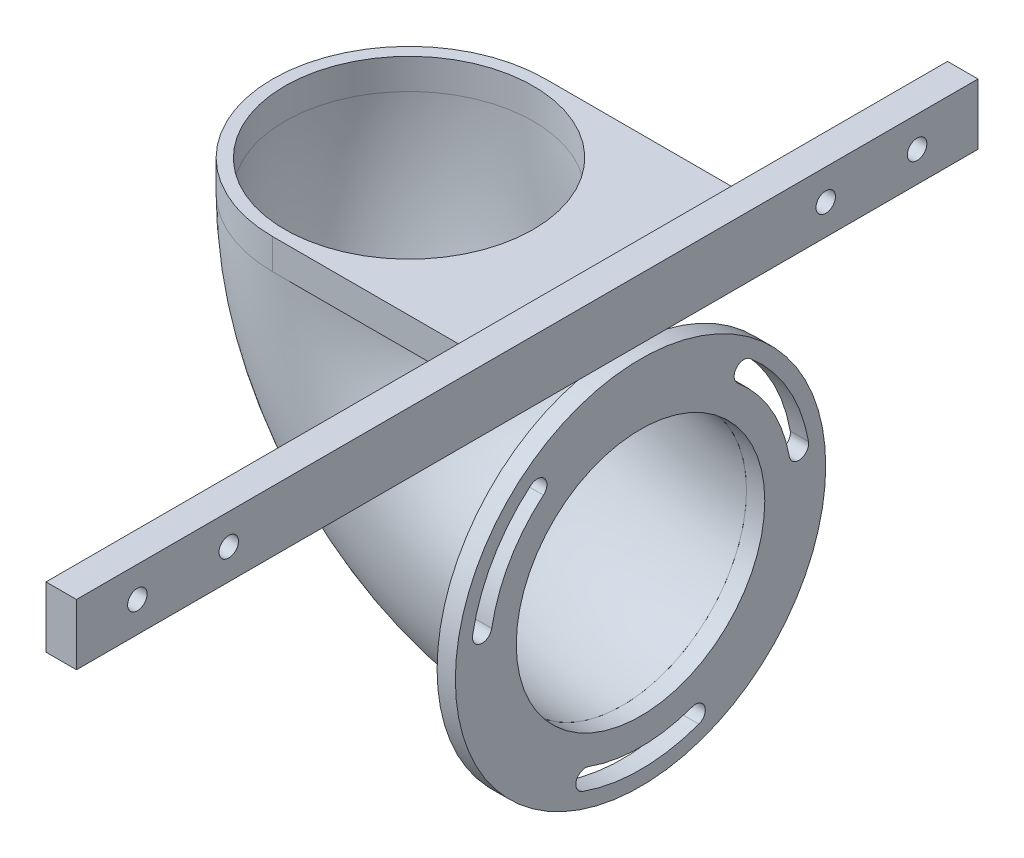
ISO-10303-21;
HEADER;
FILE_DESCRIPTION(('STEP AP214'),'2;1');
FILE_NAME('part.step','',(''),(''),'','','');
FILE_SCHEMA(('AUTOMOTIVE_DESIGN { 1 0 10303 214 1 1 1 1 }'));
ENDSEC;
DATA;
#1=APPLICATION_CONTEXT('core data for automotive mechanical design processes');
#2=APPLICATION_PROTOCOL_DEFINITION('international standard','automotive_design',2000,#1);
#3=PRODUCT_CONTEXT('',#1,'mechanical');
#4=PRODUCT('Part','Part','',(#3));
#5=PRODUCT_RELATED_PRODUCT_CATEGORY('part','',(#4));
#6=PRODUCT_DEFINITION_FORMATION('','',#4);
#7=PRODUCT_DEFINITION_CONTEXT('part definition',#1,'design');
#8=PRODUCT_DEFINITION('design','',#6,#7);
#9=PRODUCT_DEFINITION_SHAPE('','',#8);
#10=(LENGTH_UNIT() NAMED_UNIT(*) SI_UNIT(.MILLI.,.METRE.));
#11=(NAMED_UNIT(*) PLANE_ANGLE_UNIT() SI_UNIT($,.RADIAN.));
#12=(NAMED_UNIT(*) SI_UNIT($,.STERADIAN.) SOLID_ANGLE_UNIT());
#13=UNCERTAINTY_MEASURE_WITH_UNIT(LENGTH_MEASURE(1.E-05),#10,'distance_accuracy_value','');
#14=(GEOMETRIC_REPRESENTATION_CONTEXT(3) GLOBAL_UNCERTAINTY_ASSIGNED_CONTEXT((#13)) GLOBAL_UNIT_ASSIGNED_CONTEXT((#10,
#11,#12)) REPRESENTATION_CONTEXT('',''));
#15=CARTESIAN_POINT('',(0.,0.,0.));
#16=DIRECTION('',(0.,0.,1.));
#17=DIRECTION('',(1.,0.,0.));
#18=AXIS2_PLACEMENT_3D('',#15,#16,#17);
#19=CARTESIAN_POINT('',(3.,-64.807885188748,-9.02933178379769));
#20=DIRECTION('',(-1.,0.,0.));
#21=DIRECTION('',(0.,0.,1.));
#22=AXIS2_PLACEMENT_3D('',#19,#20,#21);
#23=CYLINDRICAL_SURFACE('',#22,1.6);
#24=CARTESIAN_POINT('',(0.,-64.807885188748,-9.02933178379769));
#25=DIRECTION('',(1.,0.,0.));
#26=DIRECTION('',(0.,0.,-1.));
#27=AXIS2_PLACEMENT_3D('',#24,#25,#26);
#28=CIRCLE('',#27,1.6);
#29=CARTESIAN_POINT('',(0.,-66.3113933820055,-9.57656401311876));
#30=VERTEX_POINT('',#29);
#31=CARTESIAN_POINT('',(0.,-63.3043769954906,-8.48209955447662));
#32=VERTEX_POINT('',#31);
#33=EDGE_CURVE('E208',#30,#32,#28,.T.);
#34=ORIENTED_EDGE('',*,*,#33,.F.);
#35=DIRECTION('',(-1.,0.,0.));
#36=VECTOR('',#35,1.);
#37=CARTESIAN_POINT('',(3.,-66.3113933820055,-9.57656401311876));
#38=LINE('',#37,#36);
#39=CARTESIAN_POINT('',(3.,-66.3113933820055,-9.57656401311876));
#40=VERTEX_POINT('',#39);
#41=EDGE_CURVE('E12',#40,#30,#38,.T.);
#42=ORIENTED_EDGE('',*,*,#41,.F.);
#43=CARTESIAN_POINT('',(3.,-64.807885188748,-9.02933178379769));
#44=DIRECTION('',(1.,0.,0.));
#45=DIRECTION('',(0.,0.,-1.));
#46=AXIS2_PLACEMENT_3D('',#43,#44,#45);
#47=CIRCLE('',#46,1.6);
#48=CARTESIAN_POINT('',(3.,-63.3043769954906,-8.48209955447662));
#49=VERTEX_POINT('',#48);
#50=EDGE_CURVE('E170',#40,#49,#47,.T.);
#51=ORIENTED_EDGE('',*,*,#50,.T.);
#52=DIRECTION('',(-1.,0.,0.));
#53=VECTOR('',#52,1.);
#54=CARTESIAN_POINT('',(3.,-63.3043769954906,-8.48209955447662));
#55=LINE('',#54,#53);
#56=EDGE_CURVE('E122',#49,#32,#55,.T.);
#57=ORIENTED_EDGE('',*,*,#56,.T.);
#58=EDGE_LOOP('',(#34,#42,#51,#57));
#59=FACE_BOUND('',#58,.T.);
#60=ADVANCED_FACE('F57',(#59),#23,.F.);
#61=CARTESIAN_POINT('',(3.,-40.,0.));
#62=DIRECTION('',(-1.,0.,0.));
#63=DIRECTION('',(0.,0.,1.));
#64=AXIS2_PLACEMENT_3D('',#61,#62,#63);
#65=CYLINDRICAL_SURFACE('',#64,28.);
#66=CARTESIAN_POINT('',(0.,-40.,0.));
#67=DIRECTION('',(1.,0.,0.));
#68=DIRECTION('',(0.,0.,-1.));
#69=AXIS2_PLACEMENT_3D('',#66,#67,#68);
#70=CIRCLE('',#69,28.);
#71=CARTESIAN_POINT('',(0.,-66.3113933820055,9.57656401311874));
#72=VERTEX_POINT('',#71);
#73=EDGE_CURVE('E161',#72,#30,#70,.T.);
#74=ORIENTED_EDGE('',*,*,#73,.F.);
#75=DIRECTION('',(-1.,0.,0.));
#76=VECTOR('',#75,1.);
#77=CARTESIAN_POINT('',(3.,-66.3113933820055,9.57656401311874));
#78=LINE('',#77,#76);
#79=CARTESIAN_POINT('',(3.,-66.3113933820055,9.57656401311874));
#80=VERTEX_POINT('',#79);
#81=EDGE_CURVE('E67',#80,#72,#78,.T.);
#82=ORIENTED_EDGE('',*,*,#81,.F.);
#83=CARTESIAN_POINT('',(3.,-40.,0.));
#84=DIRECTION('',(1.,0.,0.));
#85=DIRECTION('',(0.,0.,-1.));
#86=AXIS2_PLACEMENT_3D('',#83,#84,#85);
#87=CIRCLE('',#86,28.);
#88=EDGE_CURVE('E159',#80,#40,#87,.T.);
#89=ORIENTED_EDGE('',*,*,#88,.T.);
#90=ORIENTED_EDGE('',*,*,#41,.T.);
#91=EDGE_LOOP('',(#74,#82,#89,#90));
#92=FACE_BOUND('',#91,.T.);
#93=ADVANCED_FACE('F158',(#92),#65,.F.);
#94=CARTESIAN_POINT('',(3.,-64.807885188748,9.02933178379766));
#95=DIRECTION('',(-1.,0.,0.));
#96=DIRECTION('',(0.,0.,1.));
#97=AXIS2_PLACEMENT_3D('',#94,#95,#96);
#98=CYLINDRICAL_SURFACE('',#97,1.6);
#99=CARTESIAN_POINT('',(0.,-64.807885188748,9.02933178379766));
#100=DIRECTION('',(1.,0.,0.));
#101=DIRECTION('',(0.,0.,-1.));
#102=AXIS2_PLACEMENT_3D('',#99,#100,#101);
#103=CIRCLE('',#102,1.6);
#104=CARTESIAN_POINT('',(0.,-63.3043769954906,8.4820995544766));
#105=VERTEX_POINT('',#104);
#106=EDGE_CURVE('E212',#105,#72,#103,.T.);
#107=ORIENTED_EDGE('',*,*,#106,.F.);
#108=DIRECTION('',(-1.,0.,0.));
#109=VECTOR('',#108,1.);
#110=CARTESIAN_POINT('',(3.,-63.3043769954906,8.4820995544766));
#111=LINE('',#110,#109);
#112=CARTESIAN_POINT('',(3.,-63.3043769954906,8.4820995544766));
#113=VERTEX_POINT('',#112);
#114=EDGE_CURVE('E115',#113,#105,#111,.T.);
#115=ORIENTED_EDGE('',*,*,#114,.F.);
#116=CARTESIAN_POINT('',(3.,-64.807885188748,9.02933178379766));
#117=DIRECTION('',(1.,0.,0.));
#118=DIRECTION('',(0.,0.,-1.));
#119=AXIS2_PLACEMENT_3D('',#116,#117,#118);
#120=CIRCLE('',#119,1.6);
#121=EDGE_CURVE('E169',#113,#80,#120,.T.);
#122=ORIENTED_EDGE('',*,*,#121,.T.);
#123=ORIENTED_EDGE('',*,*,#81,.T.);
#124=EDGE_LOOP('',(#107,#115,#122,#123));
#125=FACE_BOUND('',#124,.T.);
#126=ADVANCED_FACE('F172',(#125),#98,.F.);
#127=CARTESIAN_POINT('',(3.,-35.4156881095929,25.9989246795223));
#128=DIRECTION('',(-1.,0.,0.));
#129=DIRECTION('',(0.,0.,1.));
#130=AXIS2_PLACEMENT_3D('',#127,#128,#129);
#131=CYLINDRICAL_SURFACE('',#130,1.6);
#132=CARTESIAN_POINT('',(0.,-35.4156881095929,25.9989246795223));
#133=DIRECTION('',(1.,0.,0.));
#134=DIRECTION('',(0.,0.,-1.));
#135=AXIS2_PLACEMENT_3D('',#132,#133,#134);
#136=CIRCLE('',#135,1.6);
#137=CARTESIAN_POINT('',(0.,-35.1378510253258,27.5746170843418));
#138=VERTEX_POINT('',#137);
#139=CARTESIAN_POINT('',(0.,-35.69352519386,24.4232322747027));
#140=VERTEX_POINT('',#139);
#141=EDGE_CURVE('E196',#138,#140,#136,.T.);
#142=ORIENTED_EDGE('',*,*,#141,.F.);
#143=DIRECTION('',(-1.,0.,0.));
#144=VECTOR('',#143,1.);
#145=CARTESIAN_POINT('',(3.,-35.1378510253258,27.5746170843418));
#146=LINE('',#145,#144);
#147=CARTESIAN_POINT('',(3.,-35.1378510253258,27.5746170843418));
#148=VERTEX_POINT('',#147);
#149=EDGE_CURVE('E224',#148,#138,#146,.T.);
#150=ORIENTED_EDGE('',*,*,#149,.F.);
#151=CARTESIAN_POINT('',(3.,-35.4156881095929,25.9989246795223));
#152=DIRECTION('',(1.,0.,0.));
#153=DIRECTION('',(0.,0.,-1.));
#154=AXIS2_PLACEMENT_3D('',#151,#152,#153);
#155=CIRCLE('',#154,1.6);
#156=CARTESIAN_POINT('',(3.,-35.69352519386,24.4232322747027));
#157=VERTEX_POINT('',#156);
#158=EDGE_CURVE('E258',#148,#157,#155,.T.);
#159=ORIENTED_EDGE('',*,*,#158,.T.);
#160=DIRECTION('',(-1.,0.,0.));
#161=VECTOR('',#160,1.);
#162=CARTESIAN_POINT('',(3.,-35.69352519386,24.4232322747027));
#163=LINE('',#162,#161);
#164=EDGE_CURVE('E226',#157,#140,#163,.T.);
#165=ORIENTED_EDGE('',*,*,#164,.T.);
#166=EDGE_LOOP('',(#142,#150,#159,#165));
#167=FACE_BOUND('',#166,.T.);
#168=ADVANCED_FACE('F304',(#167),#131,.F.);
#169=CARTESIAN_POINT('',(3.,-40.,0.));
#170=DIRECTION('',(-1.,0.,0.));
#171=DIRECTION('',(0.,0.,1.));
#172=AXIS2_PLACEMENT_3D('',#169,#170,#171);
#173=CYLINDRICAL_SURFACE('',#172,28.);
#174=CARTESIAN_POINT('',(0.,-40.,0.));
#175=DIRECTION('',(1.,0.,0.));
#176=DIRECTION('',(0.,0.,-1.));
#177=AXIS2_PLACEMENT_3D('',#174,#175,#176);
#178=CIRCLE('',#177,28.);
#179=CARTESIAN_POINT('',(0.,-18.5507555926685,17.998053071223));
#180=VERTEX_POINT('',#179);
#181=EDGE_CURVE('E199',#180,#138,#178,.T.);
#182=ORIENTED_EDGE('',*,*,#181,.F.);
#183=DIRECTION('',(-1.,0.,0.));
#184=VECTOR('',#183,1.);
#185=CARTESIAN_POINT('',(3.,-18.5507555926685,17.998053071223));
#186=LINE('',#185,#184);
#187=CARTESIAN_POINT('',(3.,-18.5507555926685,17.998053071223));
#188=VERTEX_POINT('',#187);
#189=EDGE_CURVE('E230',#188,#180,#186,.T.);
#190=ORIENTED_EDGE('',*,*,#189,.F.);
#191=CARTESIAN_POINT('',(3.,-40.,0.));
#192=DIRECTION('',(1.,0.,0.));
#193=DIRECTION('',(0.,0.,-1.));
#194=AXIS2_PLACEMENT_3D('',#191,#192,#193);
#195=CIRCLE('',#194,28.);
#196=EDGE_CURVE('E267',#188,#148,#195,.T.);
#197=ORIENTED_EDGE('',*,*,#196,.T.);
#198=ORIENTED_EDGE('',*,*,#149,.T.);
#199=EDGE_LOOP('',(#182,#190,#197,#198));
#200=FACE_BOUND('',#199,.T.);
#201=ADVANCED_FACE('F300',(#200),#173,.F.);
#202=CARTESIAN_POINT('',(3.,-19.7764267016589,16.9695928957245));
#203=DIRECTION('',(-1.,0.,0.));
#204=DIRECTION('',(0.,0.,1.));
#205=AXIS2_PLACEMENT_3D('',#202,#203,#204);
#206=CYLINDRICAL_SURFACE('',#205,1.6);
#207=CARTESIAN_POINT('',(0.,-19.7764267016589,16.9695928957245));
#208=DIRECTION('',(1.,0.,0.));
#209=DIRECTION('',(0.,0.,-1.));
#210=AXIS2_PLACEMENT_3D('',#207,#208,#209);
#211=CIRCLE('',#210,1.6);
#212=CARTESIAN_POINT('',(0.,-21.0020978106492,15.9411327202261));
#213=VERTEX_POINT('',#212);
#214=EDGE_CURVE('E202',#213,#180,#211,.T.);
#215=ORIENTED_EDGE('',*,*,#214,.F.);
#216=DIRECTION('',(-1.,0.,0.));
#217=VECTOR('',#216,1.);
#218=CARTESIAN_POINT('',(3.,-21.0020978106492,15.9411327202261));
#219=LINE('',#218,#217);
#220=CARTESIAN_POINT('',(3.,-21.0020978106492,15.9411327202261));
#221=VERTEX_POINT('',#220);
#222=EDGE_CURVE('E228',#221,#213,#219,.T.);
#223=ORIENTED_EDGE('',*,*,#222,.F.);
#224=CARTESIAN_POINT('',(3.,-19.7764267016589,16.9695928957245));
#225=DIRECTION('',(1.,0.,0.));
#226=DIRECTION('',(0.,0.,-1.));
#227=AXIS2_PLACEMENT_3D('',#224,#225,#226);
#228=CIRCLE('',#227,1.6);
#229=EDGE_CURVE('E270',#221,#188,#228,.T.);
#230=ORIENTED_EDGE('',*,*,#229,.T.);
#231=ORIENTED_EDGE('',*,*,#189,.T.);
#232=EDGE_LOOP('',(#215,#223,#230,#231));
#233=FACE_BOUND('',#232,.T.);
#234=ADVANCED_FACE('F297',(#233),#206,.F.);
#235=CARTESIAN_POINT('',(3.,-19.7764267016591,-16.9695928957249));
#236=DIRECTION('',(-1.,0.,0.));
#237=DIRECTION('',(0.,0.,1.));
#238=AXIS2_PLACEMENT_3D('',#235,#236,#237);
#239=CYLINDRICAL_SURFACE('',#238,1.6);
#240=CARTESIAN_POINT('',(0.,-19.7764267016591,-16.9695928957249));
#241=DIRECTION('',(1.,0.,0.));
#242=DIRECTION('',(0.,0.,-1.));
#243=AXIS2_PLACEMENT_3D('',#240,#241,#242);
#244=CIRCLE('',#243,1.6);
#245=CARTESIAN_POINT('',(0.,-18.5507555926688,-17.9980530712233));
#246=VERTEX_POINT('',#245);
#247=CARTESIAN_POINT('',(0.,-21.0020978106495,-15.9411327202264));
#248=VERTEX_POINT('',#247);
#249=EDGE_CURVE('E184',#246,#248,#244,.T.);
#250=ORIENTED_EDGE('',*,*,#249,.F.);
#251=DIRECTION('',(-1.,0.,0.));
#252=VECTOR('',#251,1.);
#253=CARTESIAN_POINT('',(3.,-18.5507555926688,-17.9980530712233));
#254=LINE('',#253,#252);
#255=CARTESIAN_POINT('',(3.,-18.5507555926688,-17.9980530712233));
#256=VERTEX_POINT('',#255);
#257=EDGE_CURVE('E61',#256,#246,#254,.T.);
#258=ORIENTED_EDGE('',*,*,#257,.F.);
#259=CARTESIAN_POINT('',(3.,-19.7764267016591,-16.9695928957249));
#260=DIRECTION('',(1.,0.,0.));
#261=DIRECTION('',(0.,0.,-1.));
#262=AXIS2_PLACEMENT_3D('',#259,#260,#261);
#263=CIRCLE('',#262,1.6);
#264=CARTESIAN_POINT('',(3.,-21.0020978106495,-15.9411327202264));
#265=VERTEX_POINT('',#264);
#266=EDGE_CURVE('E222',#256,#265,#263,.T.);
#267=ORIENTED_EDGE('',*,*,#266,.T.);
#268=DIRECTION('',(-1.,0.,0.));
#269=VECTOR('',#268,1.);
#270=CARTESIAN_POINT('',(3.,-21.0020978106495,-15.9411327202264));
#271=LINE('',#270,#269);
#272=EDGE_CURVE('E183',#265,#248,#271,.T.);
#273=ORIENTED_EDGE('',*,*,#272,.T.);
#274=EDGE_LOOP('',(#250,#258,#267,#273));
#275=FACE_BOUND('',#274,.T.);
#276=ADVANCED_FACE('F59',(#275),#239,.F.);
#277=CARTESIAN_POINT('',(3.,-40.,0.));
#278=DIRECTION('',(-1.,0.,0.));
#279=DIRECTION('',(0.,0.,1.));
#280=AXIS2_PLACEMENT_3D('',#277,#278,#279);
#281=CYLINDRICAL_SURFACE('',#280,28.);
#282=CARTESIAN_POINT('',(0.,-40.,0.));
#283=DIRECTION('',(1.,0.,0.));
#284=DIRECTION('',(0.,0.,-1.));
#285=AXIS2_PLACEMENT_3D('',#282,#283,#284);
#286=CIRCLE('',#285,28.);
#287=CARTESIAN_POINT('',(0.,-35.1378510253262,-27.5746170843419));
#288=VERTEX_POINT('',#287);
#289=EDGE_CURVE('E187',#288,#246,#286,.T.);
#290=ORIENTED_EDGE('',*,*,#289,.F.);
#291=DIRECTION('',(-1.,0.,0.));
#292=VECTOR('',#291,1.);
#293=CARTESIAN_POINT('',(3.,-35.1378510253262,-27.5746170843419));
#294=LINE('',#293,#292);
#295=CARTESIAN_POINT('',(3.,-35.1378510253262,-27.5746170843419));
#296=VERTEX_POINT('',#295);
#297=EDGE_CURVE('E235',#296,#288,#294,.T.);
#298=ORIENTED_EDGE('',*,*,#297,.F.);
#299=CARTESIAN_POINT('',(3.,-40.,0.));
#300=DIRECTION('',(1.,0.,0.));
#301=DIRECTION('',(0.,0.,-1.));
#302=AXIS2_PLACEMENT_3D('',#299,#300,#301);
#303=CIRCLE('',#302,28.);
#304=EDGE_CURVE('E244',#296,#256,#303,.T.);
#305=ORIENTED_EDGE('',*,*,#304,.T.);
#306=ORIENTED_EDGE('',*,*,#257,.T.);
#307=EDGE_LOOP('',(#290,#298,#305,#306));
#308=FACE_BOUND('',#307,.T.);
#309=ADVANCED_FACE('F242',(#308),#281,.F.);
#310=CARTESIAN_POINT('',(3.,-35.4156881095933,-25.9989246795224));
#311=DIRECTION('',(-1.,0.,0.));
#312=DIRECTION('',(0.,0.,1.));
#313=AXIS2_PLACEMENT_3D('',#310,#311,#312);
#314=CYLINDRICAL_SURFACE('',#313,1.6);
#315=CARTESIAN_POINT('',(0.,-35.4156881095933,-25.9989246795224));
#316=DIRECTION('',(1.,0.,0.));
#317=DIRECTION('',(0.,0.,-1.));
#318=AXIS2_PLACEMENT_3D('',#315,#316,#317);
#319=CIRCLE('',#318,1.6);
#320=CARTESIAN_POINT('',(0.,-35.6935251938604,-24.4232322747029));
#321=VERTEX_POINT('',#320);
#322=EDGE_CURVE('E190',#321,#288,#319,.T.);
#323=ORIENTED_EDGE('',*,*,#322,.F.);
#324=DIRECTION('',(-1.,0.,0.));
#325=VECTOR('',#324,1.);
#326=CARTESIAN_POINT('',(3.,-35.6935251938604,-24.4232322747029));
#327=LINE('',#326,#325);
#328=CARTESIAN_POINT('',(3.,-35.6935251938604,-24.4232322747029));
#329=VERTEX_POINT('',#328);
#330=EDGE_CURVE('E234',#329,#321,#327,.T.);
#331=ORIENTED_EDGE('',*,*,#330,.F.);
#332=CARTESIAN_POINT('',(3.,-35.4156881095933,-25.9989246795224));
#333=DIRECTION('',(1.,0.,0.));
#334=DIRECTION('',(0.,0.,-1.));
#335=AXIS2_PLACEMENT_3D('',#332,#333,#334);
#336=CIRCLE('',#335,1.6);
#337=EDGE_CURVE('E253',#329,#296,#336,.T.);
#338=ORIENTED_EDGE('',*,*,#337,.T.);
#339=ORIENTED_EDGE('',*,*,#297,.T.);
#340=EDGE_LOOP('',(#323,#331,#338,#339));
#341=FACE_BOUND('',#340,.T.);
#342=ADVANCED_FACE('F250',(#341),#314,.F.);
#343=CARTESIAN_POINT('',(3.,-40.,0.));
#344=DIRECTION('',(-1.,0.,0.));
#345=DIRECTION('',(0.,0.,1.));
#346=AXIS2_PLACEMENT_3D('',#343,#344,#345);
#347=CYLINDRICAL_SURFACE('',#346,30.4);
#348=CARTESIAN_POINT('',(3.,-40.,0.));
#349=DIRECTION('',(1.,0.,0.));
#350=DIRECTION('',(0.,0.,-1.));
#351=AXIS2_PLACEMENT_3D('',#348,#349,#350);
#352=CIRCLE('',#351,30.4);
#353=CARTESIAN_POINT('',(3.,-40.,-30.4));
#354=VERTEX_POINT('',#353);
#355=EDGE_CURVE('E174',#354,#354,#352,.T.);
#356=ORIENTED_EDGE('',*,*,#355,.F.);
#357=EDGE_LOOP('',(#356));
#358=FACE_BOUND('',#357,.T.);
#359=CARTESIAN_POINT('',(0.,-40.,0.));
#360=DIRECTION('',(1.,0.,0.));
#361=DIRECTION('',(0.,0.,-1.));
#362=AXIS2_PLACEMENT_3D('',#359,#360,#361);
#363=CIRCLE('',#362,30.4);
#364=CARTESIAN_POINT('',(0.,-40.,-30.4));
#365=VERTEX_POINT('',#364);
#366=EDGE_CURVE('E216',#365,#365,#363,.T.);
#367=ORIENTED_EDGE('',*,*,#366,.T.);
#368=EDGE_LOOP('',(#367));
#369=FACE_BOUND('',#368,.T.);
#370=ADVANCED_FACE('F279',(#358,#369),#347,.T.);
#371=CARTESIAN_POINT('',(3.,-40.,0.));
#372=DIRECTION('',(-1.,0.,0.));
#373=DIRECTION('',(0.,0.,1.));
#374=AXIS2_PLACEMENT_3D('',#371,#372,#373);
#375=CYLINDRICAL_SURFACE('',#374,24.8);
#376=CARTESIAN_POINT('',(0.,-40.,0.));
#377=DIRECTION('',(1.,0.,0.));
#378=DIRECTION('',(0.,0.,-1.));
#379=AXIS2_PLACEMENT_3D('',#376,#377,#378);
#380=CIRCLE('',#379,24.8);
#381=EDGE_CURVE('E214',#105,#32,#380,.T.);
#382=ORIENTED_EDGE('',*,*,#381,.T.);
#383=ORIENTED_EDGE('',*,*,#56,.F.);
#384=CARTESIAN_POINT('',(3.,-40.,0.));
#385=DIRECTION('',(1.,0.,0.));
#386=DIRECTION('',(0.,0.,-1.));
#387=AXIS2_PLACEMENT_3D('',#384,#385,#386);
#388=CIRCLE('',#387,24.8);
#389=EDGE_CURVE('E76',#113,#49,#388,.T.);
#390=ORIENTED_EDGE('',*,*,#389,.F.);
#391=ORIENTED_EDGE('',*,*,#114,.T.);
#392=EDGE_LOOP('',(#382,#383,#390,#391));
#393=FACE_BOUND('',#392,.T.);
#394=ADVANCED_FACE('F276',(#393),#375,.T.);
#395=CARTESIAN_POINT('',(3.,-40.,0.));
#396=DIRECTION('',(-1.,0.,0.));
#397=DIRECTION('',(0.,0.,1.));
#398=AXIS2_PLACEMENT_3D('',#395,#396,#397);
#399=CYLINDRICAL_SURFACE('',#398,24.8);
#400=CARTESIAN_POINT('',(0.,-40.,0.));
#401=DIRECTION('',(1.,0.,0.));
#402=DIRECTION('',(0.,0.,-1.));
#403=AXIS2_PLACEMENT_3D('',#400,#401,#402);
#404=CIRCLE('',#403,24.8);
#405=EDGE_CURVE('E205',#213,#140,#404,.T.);
#406=ORIENTED_EDGE('',*,*,#405,.T.);
#407=ORIENTED_EDGE('',*,*,#164,.F.);
#408=CARTESIAN_POINT('',(3.,-40.,0.));
#409=DIRECTION('',(1.,0.,0.));
#410=DIRECTION('',(0.,0.,-1.));
#411=AXIS2_PLACEMENT_3D('',#408,#409,#410);
#412=CIRCLE('',#411,24.8);
#413=EDGE_CURVE('E273',#221,#157,#412,.T.);
#414=ORIENTED_EDGE('',*,*,#413,.F.);
#415=ORIENTED_EDGE('',*,*,#222,.T.);
#416=EDGE_LOOP('',(#406,#407,#414,#415));
#417=FACE_BOUND('',#416,.T.);
#418=ADVANCED_FACE('F278',(#417),#399,.T.);
#419=CARTESIAN_POINT('',(3.,-40.,0.));
#420=DIRECTION('',(-1.,0.,0.));
#421=DIRECTION('',(0.,0.,1.));
#422=AXIS2_PLACEMENT_3D('',#419,#420,#421);
#423=CYLINDRICAL_SURFACE('',#422,24.8);
#424=CARTESIAN_POINT('',(0.,-40.,0.));
#425=DIRECTION('',(1.,0.,0.));
#426=DIRECTION('',(0.,0.,-1.));
#427=AXIS2_PLACEMENT_3D('',#424,#425,#426);
#428=CIRCLE('',#427,24.8);
#429=EDGE_CURVE('E193',#321,#248,#428,.T.);
#430=ORIENTED_EDGE('',*,*,#429,.T.);
#431=ORIENTED_EDGE('',*,*,#272,.F.);
#432=CARTESIAN_POINT('',(3.,-40.,0.));
#433=DIRECTION('',(1.,0.,0.));
#434=DIRECTION('',(0.,0.,-1.));
#435=AXIS2_PLACEMENT_3D('',#432,#433,#434);
#436=CIRCLE('',#435,24.8);
#437=EDGE_CURVE('E255',#329,#265,#436,.T.);
#438=ORIENTED_EDGE('',*,*,#437,.F.);
#439=ORIENTED_EDGE('',*,*,#330,.T.);
#440=EDGE_LOOP('',(#430,#431,#438,#439));
#441=FACE_BOUND('',#440,.T.);
#442=ADVANCED_FACE('F256',(#441),#423,.T.);
#443=CARTESIAN_POINT('',(3.,-40.,0.));
#444=DIRECTION('',(-1.,0.,0.));
#445=DIRECTION('',(0.,0.,1.));
#446=AXIS2_PLACEMENT_3D('',#443,#444,#445);
#447=CYLINDRICAL_SURFACE('',#446,20.4);
#448=CARTESIAN_POINT('',(3.,-40.,0.));
#449=DIRECTION('',(1.,0.,0.));
#450=DIRECTION('',(0.,0.,-1.));
#451=AXIS2_PLACEMENT_3D('',#448,#449,#450);
#452=CIRCLE('',#451,20.4);
#453=CARTESIAN_POINT('',(3.,-40.,-20.4));
#454=VERTEX_POINT('',#453);
#455=EDGE_CURVE('E180',#454,#454,#452,.T.);
#456=ORIENTED_EDGE('',*,*,#455,.T.);
#457=EDGE_LOOP('',(#456));
#458=FACE_BOUND('',#457,.T.);
#459=CARTESIAN_POINT('',(0.,-40.,0.));
#460=DIRECTION('',(1.,0.,0.));
#461=DIRECTION('',(0.,0.,-1.));
#462=AXIS2_PLACEMENT_3D('',#459,#460,#461);
#463=CIRCLE('',#462,20.4);
#464=CARTESIAN_POINT('',(0.,-40.,-20.4));
#465=VERTEX_POINT('',#464);
#466=EDGE_CURVE('E219',#465,#465,#463,.T.);
#467=ORIENTED_EDGE('',*,*,#466,.F.);
#468=EDGE_LOOP('',(#467));
#469=FACE_BOUND('',#468,.T.);
#470=ADVANCED_FACE('F311',(#458,#469),#447,.F.);
#471=CARTESIAN_POINT('',(3.,0.,0.));
#472=DIRECTION('',(1.,0.,0.));
#473=DIRECTION('',(0.,0.,-1.));
#474=AXIS2_PLACEMENT_3D('',#471,#472,#473);
#475=PLANE('',#474);
#476=ORIENTED_EDGE('',*,*,#266,.F.);
#477=ORIENTED_EDGE('',*,*,#304,.F.);
#478=ORIENTED_EDGE('',*,*,#337,.F.);
#479=ORIENTED_EDGE('',*,*,#437,.T.);
#480=EDGE_LOOP('',(#476,#477,#478,#479));
#481=FACE_BOUND('',#480,.T.);
#482=ORIENTED_EDGE('',*,*,#158,.F.);
#483=ORIENTED_EDGE('',*,*,#196,.F.);
#484=ORIENTED_EDGE('',*,*,#229,.F.);
#485=ORIENTED_EDGE('',*,*,#413,.T.);
#486=EDGE_LOOP('',(#482,#483,#484,#485));
#487=FACE_BOUND('',#486,.T.);
#488=ORIENTED_EDGE('',*,*,#50,.F.);
#489=ORIENTED_EDGE('',*,*,#88,.F.);
#490=ORIENTED_EDGE('',*,*,#121,.F.);
#491=ORIENTED_EDGE('',*,*,#389,.T.);
#492=EDGE_LOOP('',(#488,#489,#490,#491));
#493=FACE_BOUND('',#492,.T.);
#494=ORIENTED_EDGE('',*,*,#355,.T.);
#495=EDGE_LOOP('',(#494));
#496=FACE_BOUND('',#495,.T.);
#497=ORIENTED_EDGE('',*,*,#455,.F.);
#498=EDGE_LOOP('',(#497));
#499=FACE_BOUND('',#498,.T.);
#500=ADVANCED_FACE('F167',(#481,#487,#493,#496,#499),#475,.T.);
#501=CARTESIAN_POINT('',(0.,0.,0.));
#502=DIRECTION('',(1.,0.,0.));
#503=DIRECTION('',(0.,0.,-1.));
#504=AXIS2_PLACEMENT_3D('',#501,#502,#503);
#505=PLANE('',#504);
#506=ORIENTED_EDGE('',*,*,#249,.T.);
#507=ORIENTED_EDGE('',*,*,#429,.F.);
#508=ORIENTED_EDGE('',*,*,#322,.T.);
#509=ORIENTED_EDGE('',*,*,#289,.T.);
#510=EDGE_LOOP('',(#506,#507,#508,#509));
#511=FACE_BOUND('',#510,.T.);
#512=ORIENTED_EDGE('',*,*,#141,.T.);
#513=ORIENTED_EDGE('',*,*,#405,.F.);
#514=ORIENTED_EDGE('',*,*,#214,.T.);
#515=ORIENTED_EDGE('',*,*,#181,.T.);
#516=EDGE_LOOP('',(#512,#513,#514,#515));
#517=FACE_BOUND('',#516,.T.);
#518=ORIENTED_EDGE('',*,*,#33,.T.);
#519=ORIENTED_EDGE('',*,*,#381,.F.);
#520=ORIENTED_EDGE('',*,*,#106,.T.);
#521=ORIENTED_EDGE('',*,*,#73,.T.);
#522=EDGE_LOOP('',(#518,#519,#520,#521));
#523=FACE_BOUND('',#522,.T.);
#524=ORIENTED_EDGE('',*,*,#366,.F.);
#525=EDGE_LOOP('',(#524));
#526=FACE_BOUND('',#525,.T.);
#527=ORIENTED_EDGE('',*,*,#466,.T.);
#528=EDGE_LOOP('',(#527));
#529=FACE_BOUND('',#528,.T.);
#530=ADVANCED_FACE('F248',(#511,#517,#523,#526,#529),#505,.F.);
#531=CLOSED_SHELL('',(#60,#93,#126,#168,#201,#234,#276,#309,#342,#370,#394,#418,#442,#470,#500,#530));
#532=MANIFOLD_SOLID_BREP('B2',#531);
#533=CARTESIAN_POINT('',(-35.,1.2490009027033E-13,0.));
#534=DIRECTION('',(0.,1.,0.));
#535=DIRECTION('',(-1.,0.,0.));
#536=AXIS2_PLACEMENT_3D('',#533,#534,#535);
#537=PLANE('',#536);
#538=CARTESIAN_POINT('',(-35.,1.2490009027033E-13,0.));
#539=DIRECTION('',(0.,1.,0.));
#540=DIRECTION('',(-1.,0.,0.));
#541=AXIS2_PLACEMENT_3D('',#538,#539,#540);
#542=CIRCLE('',#541,20.4);
#543=CARTESIAN_POINT('',(-55.4,1.9612630958273E-13,0.));
#544=VERTEX_POINT('',#543);
#545=EDGE_CURVE('E577',#544,#544,#542,.T.);
#546=ORIENTED_EDGE('',*,*,#545,.F.);
#547=EDGE_LOOP('',(#546));
#548=FACE_BOUND('',#547,.T.);
#549=DIRECTION('',(1.,0.,0.));
#550=VECTOR('',#549,1.);
#551=CARTESIAN_POINT('',(3.00000000000014,0.,22.4));
#552=LINE('',#551,#550);
#553=CARTESIAN_POINT('',(-35.,1.2490009027033E-13,22.4));
#554=VERTEX_POINT('',#553);
#555=CARTESIAN_POINT('',(-1.99999999999987,0.,22.4));
#556=VERTEX_POINT('',#555);
#557=EDGE_CURVE('E582',#554,#556,#552,.T.);
#558=ORIENTED_EDGE('',*,*,#557,.T.);
#559=DIRECTION('',(0.,0.,-1.));
#560=VECTOR('',#559,1.);
#561=CARTESIAN_POINT('',(-1.99999999999986,0.,0.));
#562=LINE('',#561,#560);
#563=CARTESIAN_POINT('',(-1.99999999999986,1.2490009027033E-13,-22.4));
#564=VERTEX_POINT('',#563);
#565=EDGE_CURVE('E571',#556,#564,#562,.T.);
#566=ORIENTED_EDGE('',*,*,#565,.T.);
#567=DIRECTION('',(-1.,0.,0.));
#568=VECTOR('',#567,1.);
#569=CARTESIAN_POINT('',(3.00000000000014,0.,-22.4));
#570=LINE('',#569,#568);
#571=CARTESIAN_POINT('',(-35.,1.2490009027033E-13,-22.4));
#572=VERTEX_POINT('',#571);
#573=EDGE_CURVE('E585',#564,#572,#570,.T.);
#574=ORIENTED_EDGE('',*,*,#573,.T.);
#575=CARTESIAN_POINT('',(-35.,1.2490009027033E-13,0.));
#576=DIRECTION('',(0.,1.,0.));
#577=DIRECTION('',(-1.,0.,0.));
#578=AXIS2_PLACEMENT_3D('',#575,#576,#577);
#579=CIRCLE('',#578,22.4);
#580=EDGE_CURVE('E589',#572,#554,#579,.T.);
#581=ORIENTED_EDGE('',*,*,#580,.T.);
#582=EDGE_LOOP('',(#558,#566,#574,#581));
#583=FACE_BOUND('',#582,.T.);
#584=ADVANCED_FACE('F441',(#548,#583),#537,.T.);
#585=CARTESIAN_POINT('',(-35.,-4.99999999999987,0.));
#586=DIRECTION('',(0.,1.,0.));
#587=DIRECTION('',(-1.,0.,0.));
#588=AXIS2_PLACEMENT_3D('',#585,#586,#587);
#589=PLANE('',#588);
#590=DIRECTION('',(0.,0.,-1.));
#591=VECTOR('',#590,1.);
#592=CARTESIAN_POINT('',(-1.99999999999988,-4.99999999999999,0.));
#593=LINE('',#592,#591);
#594=CARTESIAN_POINT('',(-1.99999999999987,-4.99999999999999,22.4));
#595=VERTEX_POINT('',#594);
#596=CARTESIAN_POINT('',(-1.99999999999987,-4.99999999999999,-22.4));
#597=VERTEX_POINT('',#596);
#598=EDGE_CURVE('E465',#595,#597,#593,.T.);
#599=ORIENTED_EDGE('',*,*,#598,.F.);
#600=DIRECTION('',(1.,0.,0.));
#601=VECTOR('',#600,1.);
#602=CARTESIAN_POINT('',(3.00000000000012,-5.00000000000001,22.4));
#603=LINE('',#602,#601);
#604=CARTESIAN_POINT('',(-35.,-4.99999999999987,22.4));
#605=VERTEX_POINT('',#604);
#606=EDGE_CURVE('E581',#605,#595,#603,.T.);
#607=ORIENTED_EDGE('',*,*,#606,.F.);
#608=CARTESIAN_POINT('',(-35.,-4.99999999999987,0.));
#609=DIRECTION('',(0.,-1.,0.));
#610=DIRECTION('',(0.,0.,-1.));
#611=AXIS2_PLACEMENT_3D('',#608,#609,#610);
#612=CIRCLE('',#611,22.4);
#613=CARTESIAN_POINT('',(-35.,-4.99999999999987,-22.4));
#614=VERTEX_POINT('',#613);
#615=EDGE_CURVE('E450',#614,#605,#612,.T.);
#616=ORIENTED_EDGE('',*,*,#615,.F.);
#617=DIRECTION('',(-1.,0.,0.));
#618=VECTOR('',#617,1.);
#619=CARTESIAN_POINT('',(3.00000000000012,-5.00000000000001,-22.4));
#620=LINE('',#619,#618);
#621=EDGE_CURVE('E595',#597,#614,#620,.T.);
#622=ORIENTED_EDGE('',*,*,#621,.F.);
#623=EDGE_LOOP('',(#599,#607,#616,#622));
#624=FACE_BOUND('',#623,.T.);
#625=ADVANCED_FACE('F624',(#624),#589,.F.);
#626=CARTESIAN_POINT('',(3.00000000000014,0.,22.4));
#627=DIRECTION('',(0.,0.,-1.));
#628=DIRECTION('',(-1.,0.,0.));
#629=AXIS2_PLACEMENT_3D('',#626,#627,#628);
#630=PLANE('',#629);
#631=DIRECTION('',(0.,-1.,0.));
#632=VECTOR('',#631,1.);
#633=CARTESIAN_POINT('',(-1.99999999999986,0.,22.4));
#634=LINE('',#633,#632);
#635=EDGE_CURVE('E457',#556,#595,#634,.T.);
#636=ORIENTED_EDGE('',*,*,#635,.F.);
#637=ORIENTED_EDGE('',*,*,#557,.F.);
#638=DIRECTION('',(0.,-1.,0.));
#639=VECTOR('',#638,1.);
#640=CARTESIAN_POINT('',(-35.,1.2490009027033E-13,22.4));
#641=LINE('',#640,#639);
#642=EDGE_CURVE('E592',#554,#605,#641,.T.);
#643=ORIENTED_EDGE('',*,*,#642,.T.);
#644=ORIENTED_EDGE('',*,*,#606,.T.);
#645=EDGE_LOOP('',(#636,#637,#643,#644));
#646=FACE_BOUND('',#645,.T.);
#647=ADVANCED_FACE('F625',(#646),#630,.F.);
#648=CARTESIAN_POINT('',(3.00000000000014,0.,-22.4));
#649=DIRECTION('',(0.,0.,1.));
#650=DIRECTION('',(1.,0.,0.));
#651=AXIS2_PLACEMENT_3D('',#648,#649,#650);
#652=PLANE('',#651);
#653=DIRECTION('',(0.,1.,0.));
#654=VECTOR('',#653,1.);
#655=CARTESIAN_POINT('',(-1.99999999999986,0.,-22.4));
#656=LINE('',#655,#654);
#657=EDGE_CURVE('E55',#597,#564,#656,.T.);
#658=ORIENTED_EDGE('',*,*,#657,.F.);
#659=ORIENTED_EDGE('',*,*,#621,.T.);
#660=DIRECTION('',(0.,-1.,0.));
#661=VECTOR('',#660,1.);
#662=CARTESIAN_POINT('',(-35.,1.2490009027033E-13,-22.4));
#663=LINE('',#662,#661);
#664=EDGE_CURVE('E603',#572,#614,#663,.T.);
#665=ORIENTED_EDGE('',*,*,#664,.F.);
#666=ORIENTED_EDGE('',*,*,#573,.F.);
#667=EDGE_LOOP('',(#658,#659,#665,#666));
#668=FACE_BOUND('',#667,.T.);
#669=ADVANCED_FACE('F634',(#668),#652,.F.);
#670=CARTESIAN_POINT('',(0.,-5.,0.));
#671=DIRECTION('',(0.,0.,1.));
#672=DIRECTION('',(1.,0.,0.));
#673=AXIS2_PLACEMENT_3D('',#670,#671,#672);
#674=TOROIDAL_SURFACE('',#673,35.,20.4);
#675=CARTESIAN_POINT('',(-35.,-4.99999999999987,0.));
#676=DIRECTION('',(0.,-1.,0.));
#677=DIRECTION('',(0.,0.,-1.));
#678=AXIS2_PLACEMENT_3D('',#675,#676,#677);
#679=CIRCLE('',#678,20.4);
#680=CARTESIAN_POINT('',(-55.4,-4.9999999999998,0.));
#681=VERTEX_POINT('',#680);
#682=EDGE_CURVE('E615',#681,#681,#679,.T.);
#683=CARTESIAN_POINT('',(0.,-40.,0.));
#684=DIRECTION('',(1.,0.,0.));
#685=DIRECTION('',(0.,0.,-1.));
#686=AXIS2_PLACEMENT_3D('',#683,#684,#685);
#687=CIRCLE('',#686,20.4);
#688=CARTESIAN_POINT('',(0.,-60.4,0.));
#689=VERTEX_POINT('',#688);
#690=EDGE_CURVE('E607',#689,#689,#687,.T.);
#691=CARTESIAN_POINT('',(0.,-5.,0.));
#692=DIRECTION('',(0.,0.,1.));
#693=DIRECTION('',(1.,0.,0.));
#694=AXIS2_PLACEMENT_3D('',#691,#692,#693);
#695=CIRCLE('',#694,55.4);
#696=EDGE_CURVE('',#681,#689,#695,.T.);
#697=ORIENTED_EDGE('',*,*,#682,.F.);
#698=ORIENTED_EDGE('',*,*,#690,.T.);
#699=ORIENTED_EDGE('',*,*,#696,.T.);
#700=ORIENTED_EDGE('',*,*,#696,.F.);
#701=EDGE_LOOP('',(#697,#699,#698,#700));
#702=FACE_BOUND('',#701,.T.);
#703=ADVANCED_FACE('F636',(#702),#674,.F.);
#704=CARTESIAN_POINT('',(0.,-5.,0.));
#705=DIRECTION('',(0.,0.,1.));
#706=DIRECTION('',(1.,0.,0.));
#707=AXIS2_PLACEMENT_3D('',#704,#705,#706);
#708=TOROIDAL_SURFACE('',#707,35.,22.4);
#709=ORIENTED_EDGE('',*,*,#615,.T.);
#710=CARTESIAN_POINT('',(-35.,-4.99999999999987,0.));
#711=DIRECTION('',(0.,1.,0.));
#712=DIRECTION('',(-1.,0.,0.));
#713=AXIS2_PLACEMENT_3D('',#710,#711,#712);
#714=CIRCLE('',#713,22.4);
#715=EDGE_CURVE('E586',#614,#605,#714,.T.);
#716=ORIENTED_EDGE('',*,*,#715,.F.);
#717=EDGE_LOOP('',(#709,#716));
#718=FACE_BOUND('',#717,.T.);
#719=CARTESIAN_POINT('',(0.,-40.,0.));
#720=DIRECTION('',(1.,0.,0.));
#721=DIRECTION('',(0.,0.,-1.));
#722=AXIS2_PLACEMENT_3D('',#719,#720,#721);
#723=CIRCLE('',#722,22.4);
#724=CARTESIAN_POINT('',(0.,-40.,-22.4));
#725=VERTEX_POINT('',#724);
#726=EDGE_CURVE('E611',#725,#725,#723,.T.);
#727=ORIENTED_EDGE('',*,*,#726,.F.);
#728=EDGE_LOOP('',(#727));
#729=FACE_BOUND('',#728,.T.);
#730=ADVANCED_FACE('F443',(#718,#729),#708,.T.);
#731=CARTESIAN_POINT('',(0.,0.,0.));
#732=DIRECTION('',(1.,0.,0.));
#733=DIRECTION('',(0.,0.,-1.));
#734=AXIS2_PLACEMENT_3D('',#731,#732,#733);
#735=PLANE('',#734);
#736=ORIENTED_EDGE('',*,*,#690,.F.);
#737=EDGE_LOOP('',(#736));
#738=FACE_BOUND('',#737,.T.);
#739=ORIENTED_EDGE('',*,*,#726,.T.);
#740=EDGE_LOOP('',(#739));
#741=FACE_BOUND('',#740,.T.);
#742=ADVANCED_FACE('F660',(#738,#741),#735,.T.);
#743=CARTESIAN_POINT('',(-35.,1.2490009027033E-13,0.));
#744=DIRECTION('',(0.,-1.,0.));
#745=DIRECTION('',(1.,0.,0.));
#746=AXIS2_PLACEMENT_3D('',#743,#744,#745);
#747=CYLINDRICAL_SURFACE('',#746,22.4);
#748=ORIENTED_EDGE('',*,*,#715,.T.);
#749=ORIENTED_EDGE('',*,*,#642,.F.);
#750=ORIENTED_EDGE('',*,*,#580,.F.);
#751=ORIENTED_EDGE('',*,*,#664,.T.);
#752=EDGE_LOOP('',(#748,#749,#750,#751));
#753=FACE_BOUND('',#752,.T.);
#754=ADVANCED_FACE('F632',(#753),#747,.T.);
#755=CARTESIAN_POINT('',(-35.,1.2490009027033E-13,0.));
#756=DIRECTION('',(0.,-1.,0.));
#757=DIRECTION('',(1.,0.,0.));
#758=AXIS2_PLACEMENT_3D('',#755,#756,#757);
#759=CYLINDRICAL_SURFACE('',#758,20.4);
#760=ORIENTED_EDGE('',*,*,#545,.T.);
#761=EDGE_LOOP('',(#760));
#762=FACE_BOUND('',#761,.T.);
#763=ORIENTED_EDGE('',*,*,#682,.T.);
#764=EDGE_LOOP('',(#763));
#765=FACE_BOUND('',#764,.T.);
#766=ADVANCED_FACE('F657',(#762,#765),#759,.F.);
#767=CARTESIAN_POINT('',(-1.99999999999986,0.,0.));
#768=DIRECTION('',(1.,0.,0.));
#769=DIRECTION('',(0.,1.,0.));
#770=AXIS2_PLACEMENT_3D('',#767,#768,#769);
#771=PLANE('',#770);
#772=CARTESIAN_POINT('',(-1.99999999999987,-2.49999999999999,67.6));
#773=DIRECTION('',(1.,0.,0.));
#774=DIRECTION('',(0.,1.,0.));
#775=AXIS2_PLACEMENT_3D('',#772,#773,#774);
#776=CIRCLE('',#775,1.60000000000001);
#777=CARTESIAN_POINT('',(-1.99999999999986,-0.899999999999985,67.6));
#778=VERTEX_POINT('',#777);
#779=EDGE_CURVE('E699',#778,#778,#776,.T.);
#780=ORIENTED_EDGE('',*,*,#779,.T.);
#781=EDGE_LOOP('',(#780));
#782=FACE_BOUND('',#781,.T.);
#783=CARTESIAN_POINT('',(-1.99999999999987,-2.49999999999999,82.6));
#784=DIRECTION('',(1.,0.,0.));
#785=DIRECTION('',(0.,1.,0.));
#786=AXIS2_PLACEMENT_3D('',#783,#784,#785);
#787=CIRCLE('',#786,1.60000000000001);
#788=CARTESIAN_POINT('',(-1.99999999999986,-0.899999999999985,82.6));
#789=VERTEX_POINT('',#788);
#790=EDGE_CURVE('E705',#789,#789,#787,.T.);
#791=ORIENTED_EDGE('',*,*,#790,.T.);
#792=EDGE_LOOP('',(#791));
#793=FACE_BOUND('',#792,.T.);
#794=CARTESIAN_POINT('',(-1.99999999999987,-2.49999999999999,-45.4));
#795=DIRECTION('',(1.,0.,0.));
#796=DIRECTION('',(0.,1.,0.));
#797=AXIS2_PLACEMENT_3D('',#794,#795,#796);
#798=CIRCLE('',#797,1.6);
#799=CARTESIAN_POINT('',(-1.99999999999986,-0.899999999999992,-45.4));
#800=VERTEX_POINT('',#799);
#801=EDGE_CURVE('E711',#800,#800,#798,.T.);
#802=ORIENTED_EDGE('',*,*,#801,.T.);
#803=EDGE_LOOP('',(#802));
#804=FACE_BOUND('',#803,.T.);
#805=CARTESIAN_POINT('',(-1.99999999999987,-2.49999999999999,-30.4));
#806=DIRECTION('',(1.,0.,0.));
#807=DIRECTION('',(0.,1.,0.));
#808=AXIS2_PLACEMENT_3D('',#805,#806,#807);
#809=CIRCLE('',#808,1.60000000000001);
#810=CARTESIAN_POINT('',(-1.99999999999986,-0.899999999999985,-30.4));
#811=VERTEX_POINT('',#810);
#812=EDGE_CURVE('E556',#811,#811,#809,.T.);
#813=ORIENTED_EDGE('',*,*,#812,.T.);
#814=EDGE_LOOP('',(#813));
#815=FACE_BOUND('',#814,.T.);
#816=DIRECTION('',(0.,1.,0.));
#817=VECTOR('',#816,1.);
#818=CARTESIAN_POINT('',(-1.99999999999985,2.50000000000001,-55.4));
#819=LINE('',#818,#817);
#820=CARTESIAN_POINT('',(-1.99999999999989,-7.49999999999999,-55.4));
#821=VERTEX_POINT('',#820);
#822=CARTESIAN_POINT('',(-1.99999999999985,2.50000000000001,-55.4));
#823=VERTEX_POINT('',#822);
#824=EDGE_CURVE('E530',#821,#823,#819,.T.);
#825=ORIENTED_EDGE('',*,*,#824,.F.);
#826=DIRECTION('',(0.,0.,-1.));
#827=VECTOR('',#826,1.);
#828=CARTESIAN_POINT('',(-1.99999999999989,-7.49999999999999,92.6));
#829=LINE('',#828,#827);
#830=CARTESIAN_POINT('',(-1.99999999999989,-7.49999999999999,92.6));
#831=VERTEX_POINT('',#830);
#832=EDGE_CURVE('E522',#831,#821,#829,.T.);
#833=ORIENTED_EDGE('',*,*,#832,.F.);
#834=DIRECTION('',(0.,-1.,0.));
#835=VECTOR('',#834,1.);
#836=CARTESIAN_POINT('',(-1.99999999999985,2.50000000000001,92.6));
#837=LINE('',#836,#835);
#838=CARTESIAN_POINT('',(-1.99999999999985,2.50000000000001,92.6));
#839=VERTEX_POINT('',#838);
#840=EDGE_CURVE('E533',#839,#831,#837,.T.);
#841=ORIENTED_EDGE('',*,*,#840,.F.);
#842=DIRECTION('',(0.,0.,1.));
#843=VECTOR('',#842,1.);
#844=CARTESIAN_POINT('',(-1.99999999999985,2.50000000000001,92.6));
#845=LINE('',#844,#843);
#846=EDGE_CURVE('E513',#823,#839,#845,.T.);
#847=ORIENTED_EDGE('',*,*,#846,.F.);
#848=EDGE_LOOP('',(#825,#833,#841,#847));
#849=FACE_BOUND('',#848,.T.);
#850=ORIENTED_EDGE('',*,*,#565,.F.);
#851=ORIENTED_EDGE('',*,*,#635,.T.);
#852=ORIENTED_EDGE('',*,*,#598,.T.);
#853=ORIENTED_EDGE('',*,*,#657,.T.);
#854=EDGE_LOOP('',(#850,#851,#852,#853));
#855=FACE_BOUND('',#854,.T.);
#856=ADVANCED_FACE('F527',(#782,#793,#804,#815,#849,#855),#771,.F.);
#857=CARTESIAN_POINT('',(-1.99999999999985,2.50000000000001,-55.4));
#858=DIRECTION('',(0.,0.,-1.));
#859=DIRECTION('',(-1.,0.,0.));
#860=AXIS2_PLACEMENT_3D('',#857,#858,#859);
#861=PLANE('',#860);
#862=DIRECTION('',(0.,1.,0.));
#863=VECTOR('',#862,1.);
#864=CARTESIAN_POINT('',(3.00000000000015,2.49999999999999,-55.4));
#865=LINE('',#864,#863);
#866=CARTESIAN_POINT('',(3.00000000000011,-7.50000000000001,-55.4));
#867=VERTEX_POINT('',#866);
#868=CARTESIAN_POINT('',(3.00000000000015,2.49999999999999,-55.4));
#869=VERTEX_POINT('',#868);
#870=EDGE_CURVE('E553',#867,#869,#865,.T.);
#871=ORIENTED_EDGE('',*,*,#870,.F.);
#872=DIRECTION('',(1.,0.,0.));
#873=VECTOR('',#872,1.);
#874=CARTESIAN_POINT('',(-1.99999999999989,-7.49999999999999,-55.4));
#875=LINE('',#874,#873);
#876=EDGE_CURVE('E537',#821,#867,#875,.T.);
#877=ORIENTED_EDGE('',*,*,#876,.F.);
#878=ORIENTED_EDGE('',*,*,#824,.T.);
#879=DIRECTION('',(1.,0.,0.));
#880=VECTOR('',#879,1.);
#881=CARTESIAN_POINT('',(-1.99999999999985,2.50000000000001,-55.4));
#882=LINE('',#881,#880);
#883=EDGE_CURVE('E510',#823,#869,#882,.T.);
#884=ORIENTED_EDGE('',*,*,#883,.T.);
#885=EDGE_LOOP('',(#871,#877,#878,#884));
#886=FACE_BOUND('',#885,.T.);
#887=ADVANCED_FACE('F536',(#886),#861,.T.);
#888=CARTESIAN_POINT('',(-1.99999999999989,-7.49999999999999,92.6));
#889=DIRECTION('',(0.,-1.,0.));
#890=DIRECTION('',(1.,0.,0.));
#891=AXIS2_PLACEMENT_3D('',#888,#889,#890);
#892=PLANE('',#891);
#893=DIRECTION('',(0.,0.,-1.));
#894=VECTOR('',#893,1.);
#895=CARTESIAN_POINT('',(3.00000000000011,-7.50000000000001,92.6));
#896=LINE('',#895,#894);
#897=CARTESIAN_POINT('',(3.00000000000011,-7.50000000000001,92.6));
#898=VERTEX_POINT('',#897);
#899=EDGE_CURVE('E539',#898,#867,#896,.T.);
#900=ORIENTED_EDGE('',*,*,#899,.F.);
#901=DIRECTION('',(1.,0.,0.));
#902=VECTOR('',#901,1.);
#903=CARTESIAN_POINT('',(-1.99999999999989,-7.49999999999999,92.6));
#904=LINE('',#903,#902);
#905=EDGE_CURVE('E564',#831,#898,#904,.T.);
#906=ORIENTED_EDGE('',*,*,#905,.F.);
#907=ORIENTED_EDGE('',*,*,#832,.T.);
#908=ORIENTED_EDGE('',*,*,#876,.T.);
#909=EDGE_LOOP('',(#900,#906,#907,#908));
#910=FACE_BOUND('',#909,.T.);
#911=ADVANCED_FACE('F739',(#910),#892,.T.);
#912=CARTESIAN_POINT('',(-1.99999999999985,2.50000000000001,92.6));
#913=DIRECTION('',(0.,0.,1.));
#914=DIRECTION('',(1.,0.,0.));
#915=AXIS2_PLACEMENT_3D('',#912,#913,#914);
#916=PLANE('',#915);
#917=DIRECTION('',(0.,-1.,0.));
#918=VECTOR('',#917,1.);
#919=CARTESIAN_POINT('',(3.00000000000015,2.49999999999999,92.6));
#920=LINE('',#919,#918);
#921=CARTESIAN_POINT('',(3.00000000000015,2.49999999999999,92.6));
#922=VERTEX_POINT('',#921);
#923=EDGE_CURVE('E543',#922,#898,#920,.T.);
#924=ORIENTED_EDGE('',*,*,#923,.F.);
#925=DIRECTION('',(1.,0.,0.));
#926=VECTOR('',#925,1.);
#927=CARTESIAN_POINT('',(-1.99999999999985,2.50000000000001,92.6));
#928=LINE('',#927,#926);
#929=EDGE_CURVE('E521',#839,#922,#928,.T.);
#930=ORIENTED_EDGE('',*,*,#929,.F.);
#931=ORIENTED_EDGE('',*,*,#840,.T.);
#932=ORIENTED_EDGE('',*,*,#905,.T.);
#933=EDGE_LOOP('',(#924,#930,#931,#932));
#934=FACE_BOUND('',#933,.T.);
#935=ADVANCED_FACE('F733',(#934),#916,.T.);
#936=CARTESIAN_POINT('',(-1.99999999999985,2.50000000000001,92.6));
#937=DIRECTION('',(0.,1.,0.));
#938=DIRECTION('',(-1.,0.,0.));
#939=AXIS2_PLACEMENT_3D('',#936,#937,#938);
#940=PLANE('',#939);
#941=DIRECTION('',(0.,0.,1.));
#942=VECTOR('',#941,1.);
#943=CARTESIAN_POINT('',(3.00000000000015,2.49999999999999,92.6));
#944=LINE('',#943,#942);
#945=EDGE_CURVE('E515',#869,#922,#944,.T.);
#946=ORIENTED_EDGE('',*,*,#945,.F.);
#947=ORIENTED_EDGE('',*,*,#883,.F.);
#948=ORIENTED_EDGE('',*,*,#846,.T.);
#949=ORIENTED_EDGE('',*,*,#929,.T.);
#950=EDGE_LOOP('',(#946,#947,#948,#949));
#951=FACE_BOUND('',#950,.T.);
#952=ADVANCED_FACE('F512',(#951),#940,.T.);
#953=CARTESIAN_POINT('',(-1.99999999999987,-2.49999999999999,-30.4));
#954=DIRECTION('',(1.,0.,0.));
#955=DIRECTION('',(0.,1.,0.));
#956=AXIS2_PLACEMENT_3D('',#953,#954,#955);
#957=CYLINDRICAL_SURFACE('',#956,1.60000000000001);
#958=ORIENTED_EDGE('',*,*,#812,.F.);
#959=EDGE_LOOP('',(#958));
#960=FACE_BOUND('',#959,.T.);
#961=CARTESIAN_POINT('',(3.00000000000013,-2.50000000000001,-30.4));
#962=DIRECTION('',(1.,0.,0.));
#963=DIRECTION('',(0.,1.,0.));
#964=AXIS2_PLACEMENT_3D('',#961,#962,#963);
#965=CIRCLE('',#964,1.60000000000001);
#966=CARTESIAN_POINT('',(3.00000000000014,-0.900000000000003,-30.4));
#967=VERTEX_POINT('',#966);
#968=EDGE_CURVE('E546',#967,#967,#965,.T.);
#969=ORIENTED_EDGE('',*,*,#968,.T.);
#970=EDGE_LOOP('',(#969));
#971=FACE_BOUND('',#970,.T.);
#972=ADVANCED_FACE('F722',(#960,#971),#957,.F.);
#973=CARTESIAN_POINT('',(-1.99999999999987,-2.49999999999999,-45.4));
#974=DIRECTION('',(1.,0.,0.));
#975=DIRECTION('',(0.,1.,0.));
#976=AXIS2_PLACEMENT_3D('',#973,#974,#975);
#977=CYLINDRICAL_SURFACE('',#976,1.6);
#978=ORIENTED_EDGE('',*,*,#801,.F.);
#979=EDGE_LOOP('',(#978));
#980=FACE_BOUND('',#979,.T.);
#981=CARTESIAN_POINT('',(3.00000000000013,-2.50000000000001,-45.4));
#982=DIRECTION('',(1.,0.,0.));
#983=DIRECTION('',(0.,1.,0.));
#984=AXIS2_PLACEMENT_3D('',#981,#982,#983);
#985=CIRCLE('',#984,1.6);
#986=CARTESIAN_POINT('',(3.00000000000014,-0.90000000000001,-45.4));
#987=VERTEX_POINT('',#986);
#988=EDGE_CURVE('E689',#987,#987,#985,.T.);
#989=ORIENTED_EDGE('',*,*,#988,.T.);
#990=EDGE_LOOP('',(#989));
#991=FACE_BOUND('',#990,.T.);
#992=ADVANCED_FACE('F724',(#980,#991),#977,.F.);
#993=CARTESIAN_POINT('',(-1.99999999999987,-2.49999999999999,82.6));
#994=DIRECTION('',(1.,0.,0.));
#995=DIRECTION('',(0.,1.,0.));
#996=AXIS2_PLACEMENT_3D('',#993,#994,#995);
#997=CYLINDRICAL_SURFACE('',#996,1.60000000000001);
#998=ORIENTED_EDGE('',*,*,#790,.F.);
#999=EDGE_LOOP('',(#998));
#1000=FACE_BOUND('',#999,.T.);
#1001=CARTESIAN_POINT('',(3.00000000000013,-2.50000000000001,82.6));
#1002=DIRECTION('',(1.,0.,0.));
#1003=DIRECTION('',(0.,1.,0.));
#1004=AXIS2_PLACEMENT_3D('',#1001,#1002,#1003);
#1005=CIRCLE('',#1004,1.60000000000001);
#1006=CARTESIAN_POINT('',(3.00000000000014,-0.900000000000003,82.6));
#1007=VERTEX_POINT('',#1006);
#1008=EDGE_CURVE('E693',#1007,#1007,#1005,.T.);
#1009=ORIENTED_EDGE('',*,*,#1008,.T.);
#1010=EDGE_LOOP('',(#1009));
#1011=FACE_BOUND('',#1010,.T.);
#1012=ADVANCED_FACE('F679',(#1000,#1011),#997,.F.);
#1013=CARTESIAN_POINT('',(-1.99999999999987,-2.49999999999999,67.6));
#1014=DIRECTION('',(1.,0.,0.));
#1015=DIRECTION('',(0.,1.,0.));
#1016=AXIS2_PLACEMENT_3D('',#1013,#1014,#1015);
#1017=CYLINDRICAL_SURFACE('',#1016,1.60000000000001);
#1018=ORIENTED_EDGE('',*,*,#779,.F.);
#1019=EDGE_LOOP('',(#1018));
#1020=FACE_BOUND('',#1019,.T.);
#1021=CARTESIAN_POINT('',(3.00000000000013,-2.50000000000001,67.6));
#1022=DIRECTION('',(1.,0.,0.));
#1023=DIRECTION('',(0.,1.,0.));
#1024=AXIS2_PLACEMENT_3D('',#1021,#1022,#1023);
#1025=CIRCLE('',#1024,1.60000000000001);
#1026=CARTESIAN_POINT('',(3.00000000000014,-0.900000000000003,67.6));
#1027=VERTEX_POINT('',#1026);
#1028=EDGE_CURVE('E696',#1027,#1027,#1025,.T.);
#1029=ORIENTED_EDGE('',*,*,#1028,.T.);
#1030=EDGE_LOOP('',(#1029));
#1031=FACE_BOUND('',#1030,.T.);
#1032=ADVANCED_FACE('F674',(#1020,#1031),#1017,.F.);
#1033=CARTESIAN_POINT('',(3.00000000000014,0.,22.4));
#1034=DIRECTION('',(-1.,0.,0.));
#1035=DIRECTION('',(0.,-1.,0.));
#1036=AXIS2_PLACEMENT_3D('',#1033,#1034,#1035);
#1037=PLANE('',#1036);
#1038=ORIENTED_EDGE('',*,*,#870,.T.);
#1039=ORIENTED_EDGE('',*,*,#945,.T.);
#1040=ORIENTED_EDGE('',*,*,#923,.T.);
#1041=ORIENTED_EDGE('',*,*,#899,.T.);
#1042=EDGE_LOOP('',(#1038,#1039,#1040,#1041));
#1043=FACE_BOUND('',#1042,.T.);
#1044=ORIENTED_EDGE('',*,*,#968,.F.);
#1045=EDGE_LOOP('',(#1044));
#1046=FACE_BOUND('',#1045,.T.);
#1047=ORIENTED_EDGE('',*,*,#988,.F.);
#1048=EDGE_LOOP('',(#1047));
#1049=FACE_BOUND('',#1048,.T.);
#1050=ORIENTED_EDGE('',*,*,#1008,.F.);
#1051=EDGE_LOOP('',(#1050));
#1052=FACE_BOUND('',#1051,.T.);
#1053=ORIENTED_EDGE('',*,*,#1028,.F.);
#1054=EDGE_LOOP('',(#1053));
#1055=FACE_BOUND('',#1054,.T.);
#1056=ADVANCED_FACE('F672',(#1043,#1046,#1049,#1052,#1055),#1037,.F.);
#1057=CLOSED_SHELL('',(#584,#625,#647,#669,#703,#730,#742,#754,#766,#856,#887,#911,#935,#952,
#972,#992,#1012,#1032,#1056));
#1058=MANIFOLD_SOLID_BREP('B6',#1057);
#1059=ADVANCED_BREP_SHAPE_REPRESENTATION('',(#18,#532,#1058),#14);
#1060=SHAPE_DEFINITION_REPRESENTATION(#9,#1059);
ENDSEC;
END-ISO-10303-21;
